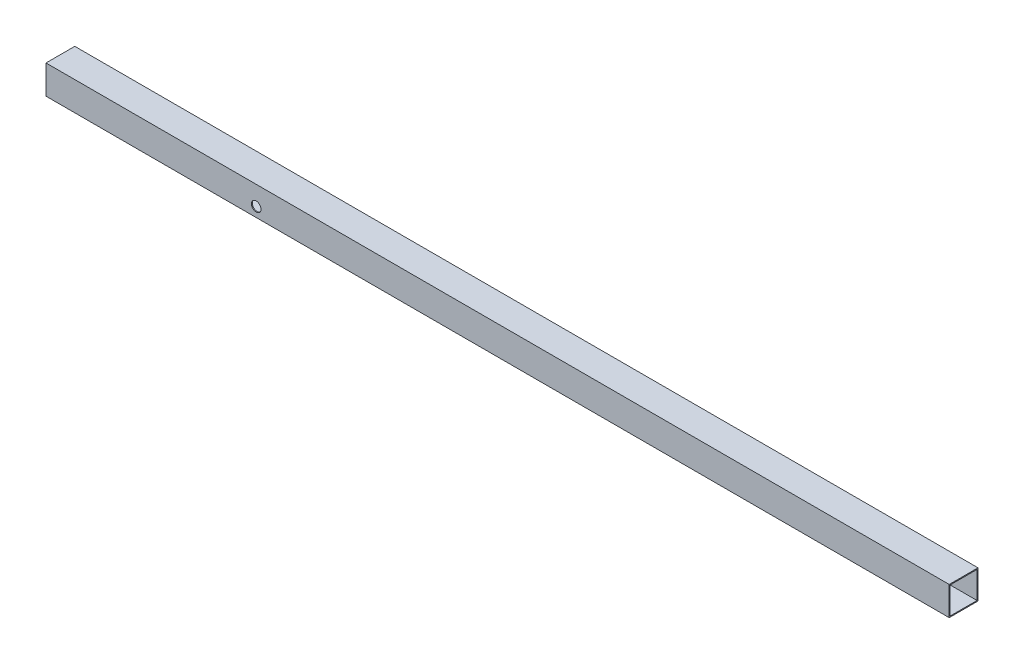
ISO-10303-21;
HEADER;
FILE_DESCRIPTION(('STEP AP214'),'2;1');
FILE_NAME('part.step','',(''),(''),'','','');
FILE_SCHEMA(('AUTOMOTIVE_DESIGN { 1 0 10303 214 1 1 1 1 }'));
ENDSEC;
DATA;
#1=APPLICATION_CONTEXT('core data for automotive mechanical design processes');
#2=APPLICATION_PROTOCOL_DEFINITION('international standard','automotive_design',2000,#1);
#3=PRODUCT_CONTEXT('',#1,'mechanical');
#4=PRODUCT('Part','Part','',(#3));
#5=PRODUCT_RELATED_PRODUCT_CATEGORY('part','',(#4));
#6=PRODUCT_DEFINITION_FORMATION('','',#4);
#7=PRODUCT_DEFINITION_CONTEXT('part definition',#1,'design');
#8=PRODUCT_DEFINITION('design','',#6,#7);
#9=PRODUCT_DEFINITION_SHAPE('','',#8);
#10=(LENGTH_UNIT() NAMED_UNIT(*) SI_UNIT(.MILLI.,.METRE.));
#11=(NAMED_UNIT(*) PLANE_ANGLE_UNIT() SI_UNIT($,.RADIAN.));
#12=(NAMED_UNIT(*) SI_UNIT($,.STERADIAN.) SOLID_ANGLE_UNIT());
#13=UNCERTAINTY_MEASURE_WITH_UNIT(LENGTH_MEASURE(1.E-05),#10,'distance_accuracy_value','');
#14=(GEOMETRIC_REPRESENTATION_CONTEXT(3) GLOBAL_UNCERTAINTY_ASSIGNED_CONTEXT((#13)) GLOBAL_UNIT_ASSIGNED_CONTEXT((#10,
#11,#12)) REPRESENTATION_CONTEXT('',''));
#15=CARTESIAN_POINT('',(0.,0.,0.));
#16=DIRECTION('',(0.,0.,1.));
#17=DIRECTION('',(1.,0.,0.));
#18=AXIS2_PLACEMENT_3D('',#15,#16,#17);
#19=CARTESIAN_POINT('',(1000.,500.,440.));
#20=DIRECTION('',(0.,-1.,0.));
#21=DIRECTION('',(0.,0.,-1.));
#22=AXIS2_PLACEMENT_3D('',#19,#20,#21);
#23=PLANE('',#22);
#24=DIRECTION('',(-1.,0.,0.));
#25=VECTOR('',#24,1.);
#26=CARTESIAN_POINT('',(1000.,500.,500.));
#27=LINE('',#26,#25);
#28=CARTESIAN_POINT('',(940.,500.,500.));
#29=VERTEX_POINT('',#28);
#30=CARTESIAN_POINT('',(-942.,500.,500.));
#31=VERTEX_POINT('',#30);
#32=EDGE_CURVE('E154',#29,#31,#27,.T.);
#33=ORIENTED_EDGE('',*,*,#32,.F.);
#34=DIRECTION('',(0.,0.,-1.));
#35=VECTOR('',#34,1.);
#36=CARTESIAN_POINT('',(940.,500.,440.));
#37=LINE('',#36,#35);
#38=CARTESIAN_POINT('',(940.,500.,440.));
#39=VERTEX_POINT('',#38);
#40=EDGE_CURVE('E136',#29,#39,#37,.T.);
#41=ORIENTED_EDGE('',*,*,#40,.T.);
#42=DIRECTION('',(-1.,0.,0.));
#43=VECTOR('',#42,1.);
#44=CARTESIAN_POINT('',(1000.,500.,440.));
#45=LINE('',#44,#43);
#46=CARTESIAN_POINT('',(-942.,500.,440.));
#47=VERTEX_POINT('',#46);
#48=EDGE_CURVE('E127',#39,#47,#45,.T.);
#49=ORIENTED_EDGE('',*,*,#48,.T.);
#50=DIRECTION('',(0.,0.,1.));
#51=VECTOR('',#50,1.);
#52=CARTESIAN_POINT('',(-942.,500.,440.));
#53=LINE('',#52,#51);
#54=EDGE_CURVE('E133',#47,#31,#53,.T.);
#55=ORIENTED_EDGE('',*,*,#54,.T.);
#56=EDGE_LOOP('',(#33,#41,#49,#55));
#57=FACE_BOUND('',#56,.T.);
#58=ADVANCED_FACE('F19',(#57),#23,.F.);
#59=CARTESIAN_POINT('',(1000.,440.,500.));
#60=DIRECTION('',(0.,0.,-1.));
#61=DIRECTION('',(-1.,0.,0.));
#62=AXIS2_PLACEMENT_3D('',#59,#60,#61);
#63=PLANE('',#62);
#64=CARTESIAN_POINT('',(-504.,460.,500.));
#65=DIRECTION('',(0.,0.,1.));
#66=DIRECTION('',(1.,0.,0.));
#67=AXIS2_PLACEMENT_3D('',#64,#65,#66);
#68=CIRCLE('',#67,9.99999999999998);
#69=CARTESIAN_POINT('',(-494.,460.,500.));
#70=VERTEX_POINT('',#69);
#71=EDGE_CURVE('E189',#70,#70,#68,.T.);
#72=ORIENTED_EDGE('',*,*,#71,.F.);
#73=EDGE_LOOP('',(#72));
#74=FACE_BOUND('',#73,.T.);
#75=DIRECTION('',(-1.,0.,0.));
#76=VECTOR('',#75,1.);
#77=CARTESIAN_POINT('',(1000.,440.,500.));
#78=LINE('',#77,#76);
#79=CARTESIAN_POINT('',(940.,440.,500.));
#80=VERTEX_POINT('',#79);
#81=CARTESIAN_POINT('',(-942.,440.,500.));
#82=VERTEX_POINT('',#81);
#83=EDGE_CURVE('E65',#80,#82,#78,.T.);
#84=ORIENTED_EDGE('',*,*,#83,.F.);
#85=DIRECTION('',(0.,1.,0.));
#86=VECTOR('',#85,1.);
#87=CARTESIAN_POINT('',(940.,440.,500.));
#88=LINE('',#87,#86);
#89=EDGE_CURVE('E205',#80,#29,#88,.T.);
#90=ORIENTED_EDGE('',*,*,#89,.T.);
#91=ORIENTED_EDGE('',*,*,#32,.T.);
#92=DIRECTION('',(0.,-1.,0.));
#93=VECTOR('',#92,1.);
#94=CARTESIAN_POINT('',(-942.,440.,500.));
#95=LINE('',#94,#93);
#96=EDGE_CURVE('E150',#31,#82,#95,.T.);
#97=ORIENTED_EDGE('',*,*,#96,.T.);
#98=EDGE_LOOP('',(#84,#90,#91,#97));
#99=FACE_BOUND('',#98,.T.);
#100=ADVANCED_FACE('F232',(#74,#99),#63,.F.);
#101=CARTESIAN_POINT('',(1000.,440.,440.));
#102=DIRECTION('',(0.,1.,0.));
#103=DIRECTION('',(0.,0.,1.));
#104=AXIS2_PLACEMENT_3D('',#101,#102,#103);
#105=PLANE('',#104);
#106=DIRECTION('',(-1.,0.,0.));
#107=VECTOR('',#106,1.);
#108=CARTESIAN_POINT('',(1000.,440.,440.));
#109=LINE('',#108,#107);
#110=CARTESIAN_POINT('',(940.,440.,440.));
#111=VERTEX_POINT('',#110);
#112=CARTESIAN_POINT('',(-942.,440.,440.));
#113=VERTEX_POINT('',#112);
#114=EDGE_CURVE('E56',#111,#113,#109,.T.);
#115=ORIENTED_EDGE('',*,*,#114,.F.);
#116=DIRECTION('',(0.,0.,1.));
#117=VECTOR('',#116,1.);
#118=CARTESIAN_POINT('',(940.,440.,440.));
#119=LINE('',#118,#117);
#120=EDGE_CURVE('E203',#111,#80,#119,.T.);
#121=ORIENTED_EDGE('',*,*,#120,.T.);
#122=ORIENTED_EDGE('',*,*,#83,.T.);
#123=DIRECTION('',(0.,0.,-1.));
#124=VECTOR('',#123,1.);
#125=CARTESIAN_POINT('',(-942.,440.,440.));
#126=LINE('',#125,#124);
#127=EDGE_CURVE('E147',#82,#113,#126,.T.);
#128=ORIENTED_EDGE('',*,*,#127,.T.);
#129=EDGE_LOOP('',(#115,#121,#122,#128));
#130=FACE_BOUND('',#129,.T.);
#131=ADVANCED_FACE('F223',(#130),#105,.F.);
#132=CARTESIAN_POINT('',(1000.,440.,440.));
#133=DIRECTION('',(0.,0.,1.));
#134=DIRECTION('',(1.,0.,0.));
#135=AXIS2_PLACEMENT_3D('',#132,#133,#134);
#136=PLANE('',#135);
#137=CARTESIAN_POINT('',(-504.,460.,440.));
#138=DIRECTION('',(0.,0.,1.));
#139=DIRECTION('',(1.,0.,0.));
#140=AXIS2_PLACEMENT_3D('',#137,#138,#139);
#141=CIRCLE('',#140,9.99999999999998);
#142=CARTESIAN_POINT('',(-494.,460.,440.));
#143=VERTEX_POINT('',#142);
#144=EDGE_CURVE('E188',#143,#143,#141,.T.);
#145=ORIENTED_EDGE('',*,*,#144,.T.);
#146=EDGE_LOOP('',(#145));
#147=FACE_BOUND('',#146,.T.);
#148=ORIENTED_EDGE('',*,*,#48,.F.);
#149=DIRECTION('',(0.,-1.,0.));
#150=VECTOR('',#149,1.);
#151=CARTESIAN_POINT('',(940.,440.,440.));
#152=LINE('',#151,#150);
#153=EDGE_CURVE('E194',#39,#111,#152,.T.);
#154=ORIENTED_EDGE('',*,*,#153,.T.);
#155=ORIENTED_EDGE('',*,*,#114,.T.);
#156=DIRECTION('',(0.,1.,0.));
#157=VECTOR('',#156,1.);
#158=CARTESIAN_POINT('',(-942.,440.,440.));
#159=LINE('',#158,#157);
#160=EDGE_CURVE('E144',#113,#47,#159,.T.);
#161=ORIENTED_EDGE('',*,*,#160,.T.);
#162=EDGE_LOOP('',(#148,#154,#155,#161));
#163=FACE_BOUND('',#162,.T.);
#164=ADVANCED_FACE('F219',(#147,#163),#136,.F.);
#165=CARTESIAN_POINT('',(1000.,498.,442.));
#166=DIRECTION('',(0.,-1.,0.));
#167=DIRECTION('',(0.,0.,-1.));
#168=AXIS2_PLACEMENT_3D('',#165,#166,#167);
#169=PLANE('',#168);
#170=DIRECTION('',(-1.,0.,0.));
#171=VECTOR('',#170,1.);
#172=CARTESIAN_POINT('',(1000.,498.,442.));
#173=LINE('',#172,#171);
#174=CARTESIAN_POINT('',(940.,498.,442.));
#175=VERTEX_POINT('',#174);
#176=CARTESIAN_POINT('',(-942.,498.,442.));
#177=VERTEX_POINT('',#176);
#178=EDGE_CURVE('E169',#175,#177,#173,.T.);
#179=ORIENTED_EDGE('',*,*,#178,.F.);
#180=DIRECTION('',(0.,0.,-1.));
#181=VECTOR('',#180,1.);
#182=CARTESIAN_POINT('',(940.,498.,442.));
#183=LINE('',#182,#181);
#184=CARTESIAN_POINT('',(940.,498.,498.));
#185=VERTEX_POINT('',#184);
#186=EDGE_CURVE('E198',#185,#175,#183,.T.);
#187=ORIENTED_EDGE('',*,*,#186,.F.);
#188=DIRECTION('',(-1.,0.,0.));
#189=VECTOR('',#188,1.);
#190=CARTESIAN_POINT('',(1000.,498.,498.));
#191=LINE('',#190,#189);
#192=CARTESIAN_POINT('',(-942.,498.,498.));
#193=VERTEX_POINT('',#192);
#194=EDGE_CURVE('E125',#185,#193,#191,.T.);
#195=ORIENTED_EDGE('',*,*,#194,.T.);
#196=DIRECTION('',(0.,0.,1.));
#197=VECTOR('',#196,1.);
#198=CARTESIAN_POINT('',(-942.,498.,442.));
#199=LINE('',#198,#197);
#200=EDGE_CURVE('E109',#177,#193,#199,.T.);
#201=ORIENTED_EDGE('',*,*,#200,.F.);
#202=EDGE_LOOP('',(#179,#187,#195,#201));
#203=FACE_BOUND('',#202,.T.);
#204=ADVANCED_FACE('F22',(#203),#169,.T.);
#205=CARTESIAN_POINT('',(1000.,442.,442.));
#206=DIRECTION('',(0.,0.,1.));
#207=DIRECTION('',(1.,0.,0.));
#208=AXIS2_PLACEMENT_3D('',#205,#206,#207);
#209=PLANE('',#208);
#210=CARTESIAN_POINT('',(-504.,460.,442.));
#211=DIRECTION('',(0.,0.,1.));
#212=DIRECTION('',(1.,0.,0.));
#213=AXIS2_PLACEMENT_3D('',#210,#211,#212);
#214=CIRCLE('',#213,9.99999999999998);
#215=CARTESIAN_POINT('',(-494.,460.,442.));
#216=VERTEX_POINT('',#215);
#217=EDGE_CURVE('E183',#216,#216,#214,.T.);
#218=ORIENTED_EDGE('',*,*,#217,.F.);
#219=EDGE_LOOP('',(#218));
#220=FACE_BOUND('',#219,.T.);
#221=DIRECTION('',(-1.,0.,0.));
#222=VECTOR('',#221,1.);
#223=CARTESIAN_POINT('',(1000.,442.,442.));
#224=LINE('',#223,#222);
#225=CARTESIAN_POINT('',(940.,442.,442.));
#226=VERTEX_POINT('',#225);
#227=CARTESIAN_POINT('',(-942.,442.,442.));
#228=VERTEX_POINT('',#227);
#229=EDGE_CURVE('E110',#226,#228,#224,.T.);
#230=ORIENTED_EDGE('',*,*,#229,.F.);
#231=DIRECTION('',(0.,-1.,0.));
#232=VECTOR('',#231,1.);
#233=CARTESIAN_POINT('',(940.,442.,442.));
#234=LINE('',#233,#232);
#235=EDGE_CURVE('E121',#175,#226,#234,.T.);
#236=ORIENTED_EDGE('',*,*,#235,.F.);
#237=ORIENTED_EDGE('',*,*,#178,.T.);
#238=DIRECTION('',(0.,1.,0.));
#239=VECTOR('',#238,1.);
#240=CARTESIAN_POINT('',(-942.,442.,442.));
#241=LINE('',#240,#239);
#242=EDGE_CURVE('E12',#228,#177,#241,.T.);
#243=ORIENTED_EDGE('',*,*,#242,.F.);
#244=EDGE_LOOP('',(#230,#236,#237,#243));
#245=FACE_BOUND('',#244,.T.);
#246=ADVANCED_FACE('F258',(#220,#245),#209,.T.);
#247=CARTESIAN_POINT('',(1000.,442.,442.));
#248=DIRECTION('',(0.,1.,0.));
#249=DIRECTION('',(0.,0.,1.));
#250=AXIS2_PLACEMENT_3D('',#247,#248,#249);
#251=PLANE('',#250);
#252=DIRECTION('',(-1.,0.,0.));
#253=VECTOR('',#252,1.);
#254=CARTESIAN_POINT('',(1000.,442.,498.));
#255=LINE('',#254,#253);
#256=CARTESIAN_POINT('',(940.,442.,498.));
#257=VERTEX_POINT('',#256);
#258=CARTESIAN_POINT('',(-942.,442.,498.));
#259=VERTEX_POINT('',#258);
#260=EDGE_CURVE('E41',#257,#259,#255,.T.);
#261=ORIENTED_EDGE('',*,*,#260,.F.);
#262=DIRECTION('',(0.,0.,1.));
#263=VECTOR('',#262,1.);
#264=CARTESIAN_POINT('',(940.,442.,442.));
#265=LINE('',#264,#263);
#266=EDGE_CURVE('E106',#226,#257,#265,.T.);
#267=ORIENTED_EDGE('',*,*,#266,.F.);
#268=ORIENTED_EDGE('',*,*,#229,.T.);
#269=DIRECTION('',(0.,0.,-1.));
#270=VECTOR('',#269,1.);
#271=CARTESIAN_POINT('',(-942.,442.,442.));
#272=LINE('',#271,#270);
#273=EDGE_CURVE('E32',#259,#228,#272,.T.);
#274=ORIENTED_EDGE('',*,*,#273,.F.);
#275=EDGE_LOOP('',(#261,#267,#268,#274));
#276=FACE_BOUND('',#275,.T.);
#277=ADVANCED_FACE('F105',(#276),#251,.T.);
#278=CARTESIAN_POINT('',(1000.,442.,498.));
#279=DIRECTION('',(0.,0.,-1.));
#280=DIRECTION('',(-1.,0.,0.));
#281=AXIS2_PLACEMENT_3D('',#278,#279,#280);
#282=PLANE('',#281);
#283=CARTESIAN_POINT('',(-504.,460.,498.));
#284=DIRECTION('',(0.,0.,-1.));
#285=DIRECTION('',(-1.,0.,0.));
#286=AXIS2_PLACEMENT_3D('',#283,#284,#285);
#287=CIRCLE('',#286,9.99999999999998);
#288=CARTESIAN_POINT('',(-514.,460.,498.));
#289=VERTEX_POINT('',#288);
#290=EDGE_CURVE('E24',#289,#289,#287,.T.);
#291=ORIENTED_EDGE('',*,*,#290,.F.);
#292=EDGE_LOOP('',(#291));
#293=FACE_BOUND('',#292,.T.);
#294=ORIENTED_EDGE('',*,*,#194,.F.);
#295=DIRECTION('',(0.,1.,0.));
#296=VECTOR('',#295,1.);
#297=CARTESIAN_POINT('',(940.,442.,498.));
#298=LINE('',#297,#296);
#299=EDGE_CURVE('E118',#257,#185,#298,.T.);
#300=ORIENTED_EDGE('',*,*,#299,.F.);
#301=ORIENTED_EDGE('',*,*,#260,.T.);
#302=DIRECTION('',(0.,-1.,0.));
#303=VECTOR('',#302,1.);
#304=CARTESIAN_POINT('',(-942.,442.,498.));
#305=LINE('',#304,#303);
#306=EDGE_CURVE('E139',#193,#259,#305,.T.);
#307=ORIENTED_EDGE('',*,*,#306,.F.);
#308=EDGE_LOOP('',(#294,#300,#301,#307));
#309=FACE_BOUND('',#308,.T.);
#310=ADVANCED_FACE('F124',(#293,#309),#282,.T.);
#311=CARTESIAN_POINT('',(-942.,-472.,250.));
#312=DIRECTION('',(1.,0.,0.));
#313=DIRECTION('',(0.,0.,-1.));
#314=AXIS2_PLACEMENT_3D('',#311,#312,#313);
#315=PLANE('',#314);
#316=ORIENTED_EDGE('',*,*,#200,.T.);
#317=ORIENTED_EDGE('',*,*,#306,.T.);
#318=ORIENTED_EDGE('',*,*,#273,.T.);
#319=ORIENTED_EDGE('',*,*,#242,.T.);
#320=EDGE_LOOP('',(#316,#317,#318,#319));
#321=FACE_BOUND('',#320,.T.);
#322=ORIENTED_EDGE('',*,*,#160,.F.);
#323=ORIENTED_EDGE('',*,*,#127,.F.);
#324=ORIENTED_EDGE('',*,*,#96,.F.);
#325=ORIENTED_EDGE('',*,*,#54,.F.);
#326=EDGE_LOOP('',(#322,#323,#324,#325));
#327=FACE_BOUND('',#326,.T.);
#328=ADVANCED_FACE('F221',(#321,#327),#315,.F.);
#329=CARTESIAN_POINT('',(940.,-470.,250.));
#330=DIRECTION('',(-1.,0.,0.));
#331=DIRECTION('',(0.,0.,1.));
#332=AXIS2_PLACEMENT_3D('',#329,#330,#331);
#333=PLANE('',#332);
#334=ORIENTED_EDGE('',*,*,#186,.T.);
#335=ORIENTED_EDGE('',*,*,#235,.T.);
#336=ORIENTED_EDGE('',*,*,#266,.T.);
#337=ORIENTED_EDGE('',*,*,#299,.T.);
#338=EDGE_LOOP('',(#334,#335,#336,#337));
#339=FACE_BOUND('',#338,.T.);
#340=ORIENTED_EDGE('',*,*,#89,.F.);
#341=ORIENTED_EDGE('',*,*,#120,.F.);
#342=ORIENTED_EDGE('',*,*,#153,.F.);
#343=ORIENTED_EDGE('',*,*,#40,.F.);
#344=EDGE_LOOP('',(#340,#341,#342,#343));
#345=FACE_BOUND('',#344,.T.);
#346=ADVANCED_FACE('F116',(#339,#345),#333,.F.);
#347=CARTESIAN_POINT('',(-504.,460.,0.));
#348=DIRECTION('',(0.,0.,1.));
#349=DIRECTION('',(1.,0.,0.));
#350=AXIS2_PLACEMENT_3D('',#347,#348,#349);
#351=CYLINDRICAL_SURFACE('',#350,9.99999999999998);
#352=ORIENTED_EDGE('',*,*,#290,.T.);
#353=EDGE_LOOP('',(#352));
#354=FACE_BOUND('',#353,.T.);
#355=ORIENTED_EDGE('',*,*,#71,.T.);
#356=EDGE_LOOP('',(#355));
#357=FACE_BOUND('',#356,.T.);
#358=ADVANCED_FACE('F274',(#354,#357),#351,.F.);
#359=ORIENTED_EDGE('',*,*,#217,.T.);
#360=EDGE_LOOP('',(#359));
#361=FACE_BOUND('',#360,.T.);
#362=ORIENTED_EDGE('',*,*,#144,.F.);
#363=EDGE_LOOP('',(#362));
#364=FACE_BOUND('',#363,.T.);
#365=ADVANCED_FACE('F276',(#361,#364),#351,.F.);
#366=CLOSED_SHELL('',(#58,#100,#131,#164,#204,#246,#277,#310,#328,#346,#358,#365));
#367=MANIFOLD_SOLID_BREP('B1',#366);
#368=ADVANCED_BREP_SHAPE_REPRESENTATION('',(#18,#367),#14);
#369=SHAPE_DEFINITION_REPRESENTATION(#9,#368);
ENDSEC;
END-ISO-10303-21;
